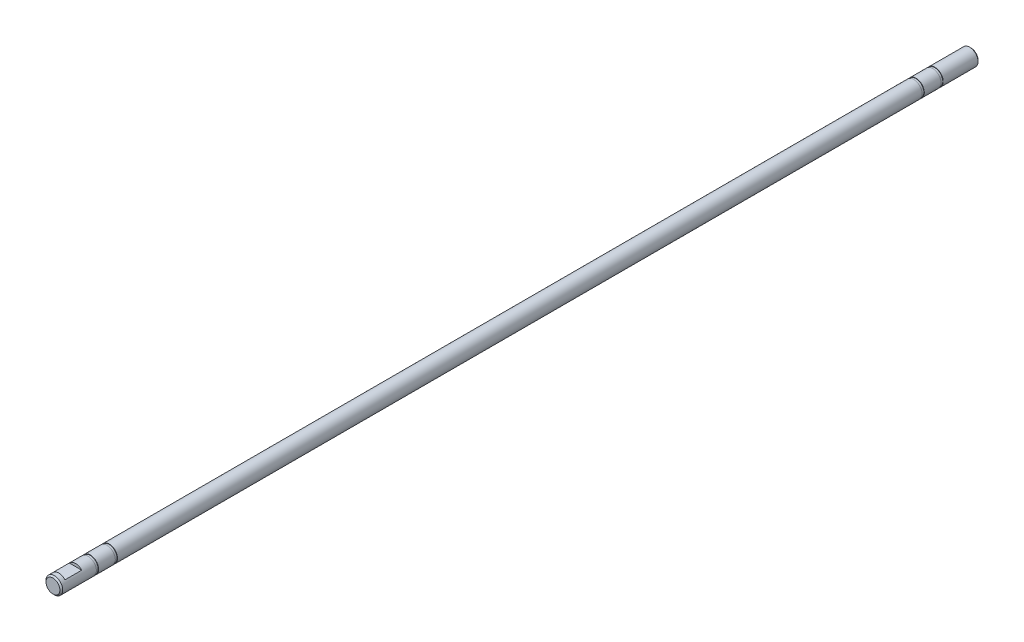
ISO-10303-21;
HEADER;
FILE_DESCRIPTION(('STEP AP214'),'2;1');
FILE_NAME('part.step','',(''),(''),'','','');
FILE_SCHEMA(('AUTOMOTIVE_DESIGN { 1 0 10303 214 1 1 1 1 }'));
ENDSEC;
DATA;
#1=APPLICATION_CONTEXT('core data for automotive mechanical design processes');
#2=APPLICATION_PROTOCOL_DEFINITION('international standard','automotive_design',2000,#1);
#3=PRODUCT_CONTEXT('',#1,'mechanical');
#4=PRODUCT('Part','Part','',(#3));
#5=PRODUCT_RELATED_PRODUCT_CATEGORY('part','',(#4));
#6=PRODUCT_DEFINITION_FORMATION('','',#4);
#7=PRODUCT_DEFINITION_CONTEXT('part definition',#1,'design');
#8=PRODUCT_DEFINITION('design','',#6,#7);
#9=PRODUCT_DEFINITION_SHAPE('','',#8);
#10=(LENGTH_UNIT() NAMED_UNIT(*) SI_UNIT(.MILLI.,.METRE.));
#11=(NAMED_UNIT(*) PLANE_ANGLE_UNIT() SI_UNIT($,.RADIAN.));
#12=(NAMED_UNIT(*) SI_UNIT($,.STERADIAN.) SOLID_ANGLE_UNIT());
#13=UNCERTAINTY_MEASURE_WITH_UNIT(LENGTH_MEASURE(1.E-05),#10,'distance_accuracy_value','');
#14=(GEOMETRIC_REPRESENTATION_CONTEXT(3) GLOBAL_UNCERTAINTY_ASSIGNED_CONTEXT((#13)) GLOBAL_UNIT_ASSIGNED_CONTEXT((#10,
#11,#12)) REPRESENTATION_CONTEXT('',''));
#15=CARTESIAN_POINT('',(0.,0.,0.));
#16=DIRECTION('',(0.,0.,1.));
#17=DIRECTION('',(1.,0.,0.));
#18=AXIS2_PLACEMENT_3D('',#15,#16,#17);
#19=CARTESIAN_POINT('',(0.,0.,330.));
#20=DIRECTION('',(0.,0.,-1.));
#21=DIRECTION('',(-1.,0.,0.));
#22=AXIS2_PLACEMENT_3D('',#19,#20,#21);
#23=CYLINDRICAL_SURFACE('',#22,3.);
#24=CARTESIAN_POINT('',(0.,0.,19.8));
#25=DIRECTION('',(0.,0.,-1.));
#26=DIRECTION('',(-1.,0.,0.));
#27=AXIS2_PLACEMENT_3D('',#24,#25,#26);
#28=CIRCLE('',#27,3.);
#29=CARTESIAN_POINT('',(-3.,0.,19.8));
#30=VERTEX_POINT('',#29);
#31=EDGE_CURVE('E198',#30,#30,#28,.T.);
#32=ORIENTED_EDGE('',*,*,#31,.T.);
#33=EDGE_LOOP('',(#32));
#34=FACE_BOUND('',#33,.T.);
#35=CARTESIAN_POINT('',(0.,0.,13.8));
#36=DIRECTION('',(0.,0.,-1.));
#37=DIRECTION('',(-1.,0.,0.));
#38=AXIS2_PLACEMENT_3D('',#35,#36,#37);
#39=CIRCLE('',#38,3.);
#40=CARTESIAN_POINT('',(-3.,0.,13.8));
#41=VERTEX_POINT('',#40);
#42=EDGE_CURVE('E84',#41,#41,#39,.T.);
#43=ORIENTED_EDGE('',*,*,#42,.F.);
#44=EDGE_LOOP('',(#43));
#45=FACE_BOUND('',#44,.T.);
#46=ADVANCED_FACE('F37',(#34,#45),#23,.T.);
#47=CARTESIAN_POINT('',(0.,0.,13.8));
#48=DIRECTION('',(0.,0.,-1.));
#49=DIRECTION('',(-1.,0.,0.));
#50=AXIS2_PLACEMENT_3D('',#47,#48,#49);
#51=PLANE('',#50);
#52=CARTESIAN_POINT('',(0.,0.,13.8));
#53=DIRECTION('',(0.,0.,-1.));
#54=DIRECTION('',(-1.,0.,0.));
#55=AXIS2_PLACEMENT_3D('',#52,#53,#54);
#56=CIRCLE('',#55,2.85);
#57=CARTESIAN_POINT('',(-2.85,0.,13.8));
#58=VERTEX_POINT('',#57);
#59=EDGE_CURVE('E188',#58,#58,#56,.T.);
#60=ORIENTED_EDGE('',*,*,#59,.F.);
#61=EDGE_LOOP('',(#60));
#62=FACE_BOUND('',#61,.T.);
#63=ORIENTED_EDGE('',*,*,#42,.T.);
#64=EDGE_LOOP('',(#63));
#65=FACE_BOUND('',#64,.T.);
#66=ADVANCED_FACE('F106',(#62,#65),#51,.T.);
#67=CARTESIAN_POINT('',(0.,0.,13.));
#68=DIRECTION('',(0.,0.,-1.));
#69=DIRECTION('',(-1.,0.,0.));
#70=AXIS2_PLACEMENT_3D('',#67,#68,#69);
#71=PLANE('',#70);
#72=CARTESIAN_POINT('',(0.,0.,13.));
#73=DIRECTION('',(0.,0.,-1.));
#74=DIRECTION('',(-1.,0.,0.));
#75=AXIS2_PLACEMENT_3D('',#72,#73,#74);
#76=CIRCLE('',#75,2.85);
#77=CARTESIAN_POINT('',(-2.85,0.,13.));
#78=VERTEX_POINT('',#77);
#79=EDGE_CURVE('E192',#78,#78,#76,.T.);
#80=ORIENTED_EDGE('',*,*,#79,.T.);
#81=EDGE_LOOP('',(#80));
#82=FACE_BOUND('',#81,.T.);
#83=CARTESIAN_POINT('',(0.,0.,13.));
#84=DIRECTION('',(0.,0.,-1.));
#85=DIRECTION('',(-1.,0.,0.));
#86=AXIS2_PLACEMENT_3D('',#83,#84,#85);
#87=CIRCLE('',#86,3.);
#88=CARTESIAN_POINT('',(-3.,0.,13.));
#89=VERTEX_POINT('',#88);
#90=EDGE_CURVE('E186',#89,#89,#87,.T.);
#91=ORIENTED_EDGE('',*,*,#90,.F.);
#92=EDGE_LOOP('',(#91));
#93=FACE_BOUND('',#92,.T.);
#94=ADVANCED_FACE('F114',(#82,#93),#71,.F.);
#95=CARTESIAN_POINT('',(0.,0.,13.8));
#96=DIRECTION('',(0.,0.,-1.));
#97=DIRECTION('',(-1.,0.,0.));
#98=AXIS2_PLACEMENT_3D('',#95,#96,#97);
#99=CYLINDRICAL_SURFACE('',#98,2.85);
#100=ORIENTED_EDGE('',*,*,#59,.T.);
#101=EDGE_LOOP('',(#100));
#102=FACE_BOUND('',#101,.T.);
#103=ORIENTED_EDGE('',*,*,#79,.F.);
#104=EDGE_LOOP('',(#103));
#105=FACE_BOUND('',#104,.T.);
#106=ADVANCED_FACE('F173',(#102,#105),#99,.T.);
#107=CARTESIAN_POINT('',(0.,0.,0.));
#108=DIRECTION('',(0.,0.,1.));
#109=DIRECTION('',(1.,0.,0.));
#110=AXIS2_PLACEMENT_3D('',#107,#108,#109);
#111=PLANE('',#110);
#112=CARTESIAN_POINT('',(0.,0.,0.));
#113=DIRECTION('',(0.,0.,1.));
#114=DIRECTION('',(1.,0.,0.));
#115=AXIS2_PLACEMENT_3D('',#112,#113,#114);
#116=CIRCLE('',#115,2.49999999999997);
#117=CARTESIAN_POINT('',(2.49999999999997,0.,0.));
#118=VERTEX_POINT('',#117);
#119=EDGE_CURVE('E90',#118,#118,#116,.F.);
#120=ORIENTED_EDGE('',*,*,#119,.T.);
#121=EDGE_LOOP('',(#120));
#122=FACE_BOUND('',#121,.T.);
#123=ADVANCED_FACE('F122',(#122),#111,.F.);
#124=CARTESIAN_POINT('',(0.,0.,0.5));
#125=DIRECTION('',(0.,0.,1.));
#126=DIRECTION('',(1.,0.,0.));
#127=AXIS2_PLACEMENT_3D('',#124,#125,#126);
#128=CIRCLE('',#127,3.);
#129=CARTESIAN_POINT('',(3.,0.,0.5));
#130=VERTEX_POINT('',#129);
#131=EDGE_CURVE('E74',#130,#130,#128,.T.);
#132=ORIENTED_EDGE('',*,*,#131,.T.);
#133=EDGE_LOOP('',(#132));
#134=FACE_BOUND('',#133,.T.);
#135=ORIENTED_EDGE('',*,*,#90,.T.);
#136=EDGE_LOOP('',(#135));
#137=FACE_BOUND('',#136,.T.);
#138=ADVANCED_FACE('F109',(#134,#137),#23,.T.);
#139=CARTESIAN_POINT('',(0.,0.,20.6));
#140=DIRECTION('',(0.,0.,-1.));
#141=DIRECTION('',(-1.,0.,0.));
#142=AXIS2_PLACEMENT_3D('',#139,#140,#141);
#143=PLANE('',#142);
#144=CARTESIAN_POINT('',(0.,0.,20.6));
#145=DIRECTION('',(0.,0.,-1.));
#146=DIRECTION('',(-1.,0.,0.));
#147=AXIS2_PLACEMENT_3D('',#144,#145,#146);
#148=CIRCLE('',#147,2.85);
#149=CARTESIAN_POINT('',(-2.85,0.,20.6));
#150=VERTEX_POINT('',#149);
#151=EDGE_CURVE('E200',#150,#150,#148,.T.);
#152=ORIENTED_EDGE('',*,*,#151,.F.);
#153=EDGE_LOOP('',(#152));
#154=FACE_BOUND('',#153,.T.);
#155=CARTESIAN_POINT('',(0.,0.,20.6));
#156=DIRECTION('',(0.,0.,-1.));
#157=DIRECTION('',(-1.,0.,0.));
#158=AXIS2_PLACEMENT_3D('',#155,#156,#157);
#159=CIRCLE('',#158,3.);
#160=CARTESIAN_POINT('',(-3.,0.,20.6));
#161=VERTEX_POINT('',#160);
#162=EDGE_CURVE('E196',#161,#161,#159,.T.);
#163=ORIENTED_EDGE('',*,*,#162,.T.);
#164=EDGE_LOOP('',(#163));
#165=FACE_BOUND('',#164,.T.);
#166=ADVANCED_FACE('F121',(#154,#165),#143,.T.);
#167=CARTESIAN_POINT('',(0.,0.,19.8));
#168=DIRECTION('',(0.,0.,-1.));
#169=DIRECTION('',(-1.,0.,0.));
#170=AXIS2_PLACEMENT_3D('',#167,#168,#169);
#171=PLANE('',#170);
#172=CARTESIAN_POINT('',(0.,0.,19.8));
#173=DIRECTION('',(0.,0.,-1.));
#174=DIRECTION('',(-1.,0.,0.));
#175=AXIS2_PLACEMENT_3D('',#172,#173,#174);
#176=CIRCLE('',#175,2.85);
#177=CARTESIAN_POINT('',(-2.85,0.,19.8));
#178=VERTEX_POINT('',#177);
#179=EDGE_CURVE('E203',#178,#178,#176,.T.);
#180=ORIENTED_EDGE('',*,*,#179,.T.);
#181=EDGE_LOOP('',(#180));
#182=FACE_BOUND('',#181,.T.);
#183=ORIENTED_EDGE('',*,*,#31,.F.);
#184=EDGE_LOOP('',(#183));
#185=FACE_BOUND('',#184,.T.);
#186=ADVANCED_FACE('F136',(#182,#185),#171,.F.);
#187=CARTESIAN_POINT('',(0.,0.,20.6));
#188=DIRECTION('',(0.,0.,-1.));
#189=DIRECTION('',(-1.,0.,0.));
#190=AXIS2_PLACEMENT_3D('',#187,#188,#189);
#191=CYLINDRICAL_SURFACE('',#190,2.85);
#192=ORIENTED_EDGE('',*,*,#151,.T.);
#193=EDGE_LOOP('',(#192));
#194=FACE_BOUND('',#193,.T.);
#195=ORIENTED_EDGE('',*,*,#179,.F.);
#196=EDGE_LOOP('',(#195));
#197=FACE_BOUND('',#196,.T.);
#198=ADVANCED_FACE('F126',(#194,#197),#191,.T.);
#199=CARTESIAN_POINT('',(0.,0.,309.8));
#200=DIRECTION('',(0.,0.,-1.));
#201=DIRECTION('',(-1.,0.,0.));
#202=AXIS2_PLACEMENT_3D('',#199,#200,#201);
#203=CIRCLE('',#202,3.);
#204=CARTESIAN_POINT('',(-3.,0.,309.8));
#205=VERTEX_POINT('',#204);
#206=EDGE_CURVE('E209',#205,#205,#203,.T.);
#207=ORIENTED_EDGE('',*,*,#206,.T.);
#208=EDGE_LOOP('',(#207));
#209=FACE_BOUND('',#208,.T.);
#210=ORIENTED_EDGE('',*,*,#162,.F.);
#211=EDGE_LOOP('',(#210));
#212=FACE_BOUND('',#211,.T.);
#213=ADVANCED_FACE('F110',(#209,#212),#23,.T.);
#214=CARTESIAN_POINT('',(0.,0.,310.6));
#215=DIRECTION('',(0.,0.,-1.));
#216=DIRECTION('',(-1.,0.,0.));
#217=AXIS2_PLACEMENT_3D('',#214,#215,#216);
#218=PLANE('',#217);
#219=CARTESIAN_POINT('',(0.,0.,310.6));
#220=DIRECTION('',(0.,0.,-1.));
#221=DIRECTION('',(-1.,0.,0.));
#222=AXIS2_PLACEMENT_3D('',#219,#220,#221);
#223=CIRCLE('',#222,2.85);
#224=CARTESIAN_POINT('',(-2.85,0.,310.6));
#225=VERTEX_POINT('',#224);
#226=EDGE_CURVE('E211',#225,#225,#223,.T.);
#227=ORIENTED_EDGE('',*,*,#226,.F.);
#228=EDGE_LOOP('',(#227));
#229=FACE_BOUND('',#228,.T.);
#230=CARTESIAN_POINT('',(0.,0.,310.6));
#231=DIRECTION('',(0.,0.,-1.));
#232=DIRECTION('',(-1.,0.,0.));
#233=AXIS2_PLACEMENT_3D('',#230,#231,#232);
#234=CIRCLE('',#233,3.);
#235=CARTESIAN_POINT('',(-3.,0.,310.6));
#236=VERTEX_POINT('',#235);
#237=EDGE_CURVE('E206',#236,#236,#234,.T.);
#238=ORIENTED_EDGE('',*,*,#237,.T.);
#239=EDGE_LOOP('',(#238));
#240=FACE_BOUND('',#239,.T.);
#241=ADVANCED_FACE('F125',(#229,#240),#218,.T.);
#242=CARTESIAN_POINT('',(0.,0.,309.8));
#243=DIRECTION('',(0.,0.,-1.));
#244=DIRECTION('',(-1.,0.,0.));
#245=AXIS2_PLACEMENT_3D('',#242,#243,#244);
#246=PLANE('',#245);
#247=CARTESIAN_POINT('',(0.,0.,309.8));
#248=DIRECTION('',(0.,0.,-1.));
#249=DIRECTION('',(-1.,0.,0.));
#250=AXIS2_PLACEMENT_3D('',#247,#248,#249);
#251=CIRCLE('',#250,2.85);
#252=CARTESIAN_POINT('',(-2.85,0.,309.8));
#253=VERTEX_POINT('',#252);
#254=EDGE_CURVE('E214',#253,#253,#251,.T.);
#255=ORIENTED_EDGE('',*,*,#254,.T.);
#256=EDGE_LOOP('',(#255));
#257=FACE_BOUND('',#256,.T.);
#258=ORIENTED_EDGE('',*,*,#206,.F.);
#259=EDGE_LOOP('',(#258));
#260=FACE_BOUND('',#259,.T.);
#261=ADVANCED_FACE('F133',(#257,#260),#246,.F.);
#262=CARTESIAN_POINT('',(0.,0.,310.6));
#263=DIRECTION('',(0.,0.,-1.));
#264=DIRECTION('',(-1.,0.,0.));
#265=AXIS2_PLACEMENT_3D('',#262,#263,#264);
#266=CYLINDRICAL_SURFACE('',#265,2.85);
#267=ORIENTED_EDGE('',*,*,#226,.T.);
#268=EDGE_LOOP('',(#267));
#269=FACE_BOUND('',#268,.T.);
#270=ORIENTED_EDGE('',*,*,#254,.F.);
#271=EDGE_LOOP('',(#270));
#272=FACE_BOUND('',#271,.T.);
#273=ADVANCED_FACE('F143',(#269,#272),#266,.T.);
#274=CARTESIAN_POINT('',(0.,0.,316.6));
#275=DIRECTION('',(0.,0.,-1.));
#276=DIRECTION('',(-1.,0.,0.));
#277=AXIS2_PLACEMENT_3D('',#274,#275,#276);
#278=CIRCLE('',#277,3.);
#279=CARTESIAN_POINT('',(-3.,0.,316.6));
#280=VERTEX_POINT('',#279);
#281=EDGE_CURVE('E220',#280,#280,#278,.T.);
#282=ORIENTED_EDGE('',*,*,#281,.T.);
#283=EDGE_LOOP('',(#282));
#284=FACE_BOUND('',#283,.T.);
#285=ORIENTED_EDGE('',*,*,#237,.F.);
#286=EDGE_LOOP('',(#285));
#287=FACE_BOUND('',#286,.T.);
#288=ADVANCED_FACE('F128',(#284,#287),#23,.T.);
#289=CARTESIAN_POINT('',(0.,0.,317.4));
#290=DIRECTION('',(0.,0.,-1.));
#291=DIRECTION('',(-1.,0.,0.));
#292=AXIS2_PLACEMENT_3D('',#289,#290,#291);
#293=PLANE('',#292);
#294=CARTESIAN_POINT('',(0.,0.,317.4));
#295=DIRECTION('',(0.,0.,-1.));
#296=DIRECTION('',(-1.,0.,0.));
#297=AXIS2_PLACEMENT_3D('',#294,#295,#296);
#298=CIRCLE('',#297,2.85);
#299=CARTESIAN_POINT('',(-2.85,0.,317.4));
#300=VERTEX_POINT('',#299);
#301=EDGE_CURVE('E222',#300,#300,#298,.T.);
#302=ORIENTED_EDGE('',*,*,#301,.F.);
#303=EDGE_LOOP('',(#302));
#304=FACE_BOUND('',#303,.T.);
#305=CARTESIAN_POINT('',(0.,0.,317.4));
#306=DIRECTION('',(0.,0.,-1.));
#307=DIRECTION('',(-1.,0.,0.));
#308=AXIS2_PLACEMENT_3D('',#305,#306,#307);
#309=CIRCLE('',#308,3.);
#310=CARTESIAN_POINT('',(-3.,0.,317.4));
#311=VERTEX_POINT('',#310);
#312=EDGE_CURVE('E217',#311,#311,#309,.T.);
#313=ORIENTED_EDGE('',*,*,#312,.T.);
#314=EDGE_LOOP('',(#313));
#315=FACE_BOUND('',#314,.T.);
#316=ADVANCED_FACE('F142',(#304,#315),#293,.T.);
#317=CARTESIAN_POINT('',(0.,0.,316.6));
#318=DIRECTION('',(0.,0.,-1.));
#319=DIRECTION('',(-1.,0.,0.));
#320=AXIS2_PLACEMENT_3D('',#317,#318,#319);
#321=PLANE('',#320);
#322=CARTESIAN_POINT('',(0.,0.,316.6));
#323=DIRECTION('',(0.,0.,-1.));
#324=DIRECTION('',(-1.,0.,0.));
#325=AXIS2_PLACEMENT_3D('',#322,#323,#324);
#326=CIRCLE('',#325,2.85);
#327=CARTESIAN_POINT('',(-2.85,0.,316.6));
#328=VERTEX_POINT('',#327);
#329=EDGE_CURVE('E78',#328,#328,#326,.T.);
#330=ORIENTED_EDGE('',*,*,#329,.T.);
#331=EDGE_LOOP('',(#330));
#332=FACE_BOUND('',#331,.T.);
#333=ORIENTED_EDGE('',*,*,#281,.F.);
#334=EDGE_LOOP('',(#333));
#335=FACE_BOUND('',#334,.T.);
#336=ADVANCED_FACE('F149',(#332,#335),#321,.F.);
#337=CARTESIAN_POINT('',(0.,0.,317.4));
#338=DIRECTION('',(0.,0.,-1.));
#339=DIRECTION('',(-1.,0.,0.));
#340=AXIS2_PLACEMENT_3D('',#337,#338,#339);
#341=CYLINDRICAL_SURFACE('',#340,2.85);
#342=ORIENTED_EDGE('',*,*,#301,.T.);
#343=EDGE_LOOP('',(#342));
#344=FACE_BOUND('',#343,.T.);
#345=ORIENTED_EDGE('',*,*,#329,.F.);
#346=EDGE_LOOP('',(#345));
#347=FACE_BOUND('',#346,.T.);
#348=ADVANCED_FACE('F164',(#344,#347),#341,.T.);
#349=CARTESIAN_POINT('',(0.,0.,330.));
#350=DIRECTION('',(0.,0.,1.));
#351=DIRECTION('',(1.,0.,0.));
#352=AXIS2_PLACEMENT_3D('',#349,#350,#351);
#353=PLANE('',#352);
#354=CARTESIAN_POINT('',(0.,0.,330.));
#355=DIRECTION('',(0.,0.,1.));
#356=DIRECTION('',(1.,0.,0.));
#357=AXIS2_PLACEMENT_3D('',#354,#355,#356);
#358=CIRCLE('',#357,2.5);
#359=CARTESIAN_POINT('',(2.5,0.,330.));
#360=VERTEX_POINT('',#359);
#361=EDGE_CURVE('E46',#360,#360,#358,.T.);
#362=ORIENTED_EDGE('',*,*,#361,.T.);
#363=EDGE_LOOP('',(#362));
#364=FACE_BOUND('',#363,.T.);
#365=ADVANCED_FACE('F95',(#364),#353,.T.);
#366=CARTESIAN_POINT('',(0.,0.,329.5));
#367=DIRECTION('',(0.,0.,1.));
#368=DIRECTION('',(1.,0.,0.));
#369=AXIS2_PLACEMENT_3D('',#366,#367,#368);
#370=CIRCLE('',#369,3.);
#371=CARTESIAN_POINT('',(3.,0.,329.5));
#372=VERTEX_POINT('',#371);
#373=EDGE_CURVE('E11',#372,#372,#370,.F.);
#374=ORIENTED_EDGE('',*,*,#373,.T.);
#375=EDGE_LOOP('',(#374));
#376=FACE_BOUND('',#375,.T.);
#377=DIRECTION('',(0.,0.,-1.));
#378=VECTOR('',#377,1.);
#379=CARTESIAN_POINT('',(-2.23606797749979,2.,330.));
#380=LINE('',#379,#378);
#381=CARTESIAN_POINT('',(-2.23606797749979,2.,321.9));
#382=VERTEX_POINT('',#381);
#383=CARTESIAN_POINT('',(-2.23606797749979,2.,327.9));
#384=VERTEX_POINT('',#383);
#385=EDGE_CURVE('E75',#382,#384,#380,.F.);
#386=ORIENTED_EDGE('',*,*,#385,.F.);
#387=CARTESIAN_POINT('',(0.,0.,321.9));
#388=DIRECTION('',(0.,0.,-1.));
#389=DIRECTION('',(-1.,0.,0.));
#390=AXIS2_PLACEMENT_3D('',#387,#388,#389);
#391=CIRCLE('',#390,3.);
#392=CARTESIAN_POINT('',(2.23606797749979,2.,321.9));
#393=VERTEX_POINT('',#392);
#394=EDGE_CURVE('E52',#382,#393,#391,.T.);
#395=ORIENTED_EDGE('',*,*,#394,.T.);
#396=DIRECTION('',(0.,0.,-1.));
#397=VECTOR('',#396,1.);
#398=CARTESIAN_POINT('',(2.23606797749979,2.,330.));
#399=LINE('',#398,#397);
#400=CARTESIAN_POINT('',(2.23606797749979,2.,327.9));
#401=VERTEX_POINT('',#400);
#402=EDGE_CURVE('E68',#401,#393,#399,.T.);
#403=ORIENTED_EDGE('',*,*,#402,.F.);
#404=CARTESIAN_POINT('',(0.,0.,327.9));
#405=DIRECTION('',(0.,0.,1.));
#406=DIRECTION('',(1.,0.,0.));
#407=AXIS2_PLACEMENT_3D('',#404,#405,#406);
#408=CIRCLE('',#407,3.);
#409=EDGE_CURVE('E59',#401,#384,#408,.T.);
#410=ORIENTED_EDGE('',*,*,#409,.T.);
#411=EDGE_LOOP('',(#386,#395,#403,#410));
#412=FACE_BOUND('',#411,.T.);
#413=ORIENTED_EDGE('',*,*,#312,.F.);
#414=EDGE_LOOP('',(#413));
#415=FACE_BOUND('',#414,.T.);
#416=ADVANCED_FACE('F80',(#376,#412,#415),#23,.T.);
#417=CARTESIAN_POINT('',(-3.,2.,321.9));
#418=DIRECTION('',(0.,0.,-1.));
#419=DIRECTION('',(-1.,0.,0.));
#420=AXIS2_PLACEMENT_3D('',#417,#418,#419);
#421=PLANE('',#420);
#422=DIRECTION('',(-1.,0.,0.));
#423=VECTOR('',#422,1.);
#424=CARTESIAN_POINT('',(-3.,2.,321.9));
#425=LINE('',#424,#423);
#426=EDGE_CURVE('E70',#393,#382,#425,.T.);
#427=ORIENTED_EDGE('',*,*,#426,.F.);
#428=ORIENTED_EDGE('',*,*,#394,.F.);
#429=EDGE_LOOP('',(#427,#428));
#430=FACE_BOUND('',#429,.T.);
#431=ADVANCED_FACE('F77',(#430),#421,.F.);
#432=CARTESIAN_POINT('',(-3.,2.,327.9));
#433=DIRECTION('',(0.,0.,1.));
#434=DIRECTION('',(1.,0.,0.));
#435=AXIS2_PLACEMENT_3D('',#432,#433,#434);
#436=PLANE('',#435);
#437=DIRECTION('',(1.,0.,0.));
#438=VECTOR('',#437,1.);
#439=CARTESIAN_POINT('',(-3.,2.,327.9));
#440=LINE('',#439,#438);
#441=EDGE_CURVE('E72',#384,#401,#440,.T.);
#442=ORIENTED_EDGE('',*,*,#441,.F.);
#443=ORIENTED_EDGE('',*,*,#409,.F.);
#444=EDGE_LOOP('',(#442,#443));
#445=FACE_BOUND('',#444,.T.);
#446=ADVANCED_FACE('F162',(#445),#436,.F.);
#447=CARTESIAN_POINT('',(0.,2.,0.));
#448=DIRECTION('',(0.,1.,0.));
#449=DIRECTION('',(0.,0.,1.));
#450=AXIS2_PLACEMENT_3D('',#447,#448,#449);
#451=PLANE('',#450);
#452=ORIENTED_EDGE('',*,*,#402,.T.);
#453=ORIENTED_EDGE('',*,*,#426,.T.);
#454=ORIENTED_EDGE('',*,*,#385,.T.);
#455=ORIENTED_EDGE('',*,*,#441,.T.);
#456=EDGE_LOOP('',(#452,#453,#454,#455));
#457=FACE_BOUND('',#456,.T.);
#458=ADVANCED_FACE('F69',(#457),#451,.T.);
#459=CARTESIAN_POINT('',(0.,0.,0.5));
#460=DIRECTION('',(0.,0.,1.));
#461=DIRECTION('',(1.,0.,0.));
#462=AXIS2_PLACEMENT_3D('',#459,#460,#461);
#463=CONICAL_SURFACE('',#462,3.,0.785398163397473);
#464=ORIENTED_EDGE('',*,*,#119,.F.);
#465=EDGE_LOOP('',(#464));
#466=FACE_BOUND('',#465,.T.);
#467=ORIENTED_EDGE('',*,*,#131,.F.);
#468=EDGE_LOOP('',(#467));
#469=FACE_BOUND('',#468,.T.);
#470=ADVANCED_FACE('F98',(#466,#469),#463,.T.);
#471=CARTESIAN_POINT('',(0.,0.,330.));
#472=DIRECTION('',(0.,0.,-1.));
#473=DIRECTION('',(-1.,0.,0.));
#474=AXIS2_PLACEMENT_3D('',#471,#472,#473);
#475=CONICAL_SURFACE('',#474,2.5,0.785398163397446);
#476=ORIENTED_EDGE('',*,*,#373,.F.);
#477=EDGE_LOOP('',(#476));
#478=FACE_BOUND('',#477,.T.);
#479=ORIENTED_EDGE('',*,*,#361,.F.);
#480=EDGE_LOOP('',(#479));
#481=FACE_BOUND('',#480,.T.);
#482=ADVANCED_FACE('F40',(#478,#481),#475,.T.);
#483=CLOSED_SHELL('',(#46,#66,#94,#106,#123,#138,#166,#186,#198,#213,#241,#261,#273,#288,#316,
#336,#348,#365,#416,#431,#446,#458,#470,#482));
#484=MANIFOLD_SOLID_BREP('B2',#483);
#485=ADVANCED_BREP_SHAPE_REPRESENTATION('',(#18,#484),#14);
#486=SHAPE_DEFINITION_REPRESENTATION(#9,#485);
ENDSEC;
END-ISO-10303-21;
